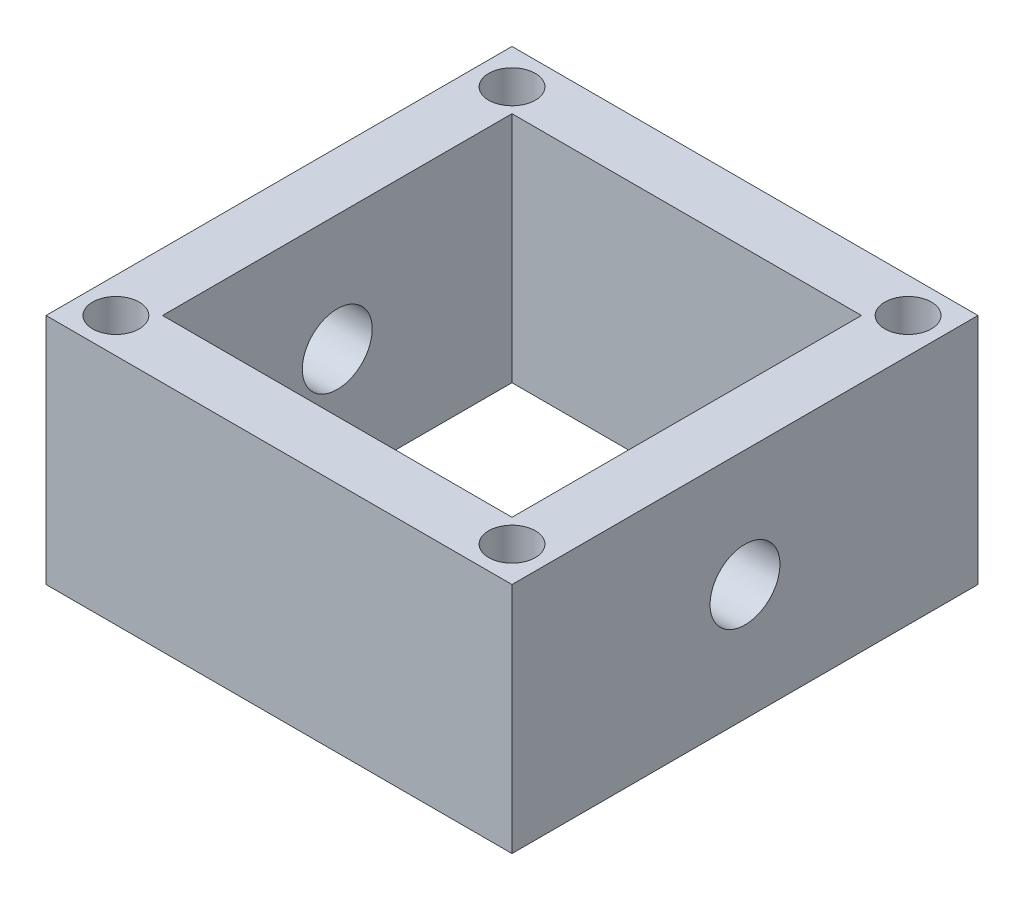
ISO-10303-21;
HEADER;
FILE_DESCRIPTION(('STEP AP214'),'2;1');
FILE_NAME('part.step','',(''),(''),'','','');
FILE_SCHEMA(('AUTOMOTIVE_DESIGN { 1 0 10303 214 1 1 1 1 }'));
ENDSEC;
DATA;
#1=APPLICATION_CONTEXT('core data for automotive mechanical design processes');
#2=APPLICATION_PROTOCOL_DEFINITION('international standard','automotive_design',2000,#1);
#3=PRODUCT_CONTEXT('',#1,'mechanical');
#4=PRODUCT('Part','Part','',(#3));
#5=PRODUCT_RELATED_PRODUCT_CATEGORY('part','',(#4));
#6=PRODUCT_DEFINITION_FORMATION('','',#4);
#7=PRODUCT_DEFINITION_CONTEXT('part definition',#1,'design');
#8=PRODUCT_DEFINITION('design','',#6,#7);
#9=PRODUCT_DEFINITION_SHAPE('','',#8);
#10=(LENGTH_UNIT() NAMED_UNIT(*) SI_UNIT(.MILLI.,.METRE.));
#11=(NAMED_UNIT(*) PLANE_ANGLE_UNIT() SI_UNIT($,.RADIAN.));
#12=(NAMED_UNIT(*) SI_UNIT($,.STERADIAN.) SOLID_ANGLE_UNIT());
#13=UNCERTAINTY_MEASURE_WITH_UNIT(LENGTH_MEASURE(1.E-05),#10,'distance_accuracy_value','');
#14=(GEOMETRIC_REPRESENTATION_CONTEXT(3) GLOBAL_UNCERTAINTY_ASSIGNED_CONTEXT((#13)) GLOBAL_UNIT_ASSIGNED_CONTEXT((#10,
#11,#12)) REPRESENTATION_CONTEXT('',''));
#15=CARTESIAN_POINT('',(0.,0.,0.));
#16=DIRECTION('',(0.,0.,1.));
#17=DIRECTION('',(1.,0.,0.));
#18=AXIS2_PLACEMENT_3D('',#15,#16,#17);
#19=CARTESIAN_POINT('',(0.,10.,0.));
#20=DIRECTION('',(0.,1.,0.));
#21=DIRECTION('',(0.,0.,1.));
#22=AXIS2_PLACEMENT_3D('',#19,#20,#21);
#23=PLANE('',#22);
#24=CARTESIAN_POINT('',(-8.5,10.,8.5));
#25=DIRECTION('',(0.,1.,0.));
#26=DIRECTION('',(0.,0.,1.));
#27=AXIS2_PLACEMENT_3D('',#24,#25,#26);
#28=CIRCLE('',#27,1.);
#29=CARTESIAN_POINT('',(-8.5,10.,9.5));
#30=VERTEX_POINT('',#29);
#31=EDGE_CURVE('E237',#30,#30,#28,.T.);
#32=ORIENTED_EDGE('',*,*,#31,.F.);
#33=EDGE_LOOP('',(#32));
#34=FACE_BOUND('',#33,.T.);
#35=CARTESIAN_POINT('',(8.5,10.,8.5));
#36=DIRECTION('',(0.,1.,0.));
#37=DIRECTION('',(0.,0.,1.));
#38=AXIS2_PLACEMENT_3D('',#35,#36,#37);
#39=CIRCLE('',#38,1.);
#40=CARTESIAN_POINT('',(8.5,10.,9.5));
#41=VERTEX_POINT('',#40);
#42=EDGE_CURVE('E243',#41,#41,#39,.T.);
#43=ORIENTED_EDGE('',*,*,#42,.F.);
#44=EDGE_LOOP('',(#43));
#45=FACE_BOUND('',#44,.T.);
#46=CARTESIAN_POINT('',(8.5,10.,-8.5));
#47=DIRECTION('',(0.,1.,0.));
#48=DIRECTION('',(0.,0.,1.));
#49=AXIS2_PLACEMENT_3D('',#46,#47,#48);
#50=CIRCLE('',#49,1.);
#51=CARTESIAN_POINT('',(8.5,10.,-7.5));
#52=VERTEX_POINT('',#51);
#53=EDGE_CURVE('E231',#52,#52,#50,.T.);
#54=ORIENTED_EDGE('',*,*,#53,.F.);
#55=EDGE_LOOP('',(#54));
#56=FACE_BOUND('',#55,.T.);
#57=CARTESIAN_POINT('',(-8.5,10.,-8.5));
#58=DIRECTION('',(0.,1.,0.));
#59=DIRECTION('',(0.,0.,1.));
#60=AXIS2_PLACEMENT_3D('',#57,#58,#59);
#61=CIRCLE('',#60,1.);
#62=CARTESIAN_POINT('',(-8.5,10.,-7.5));
#63=VERTEX_POINT('',#62);
#64=EDGE_CURVE('E228',#63,#63,#61,.T.);
#65=ORIENTED_EDGE('',*,*,#64,.F.);
#66=EDGE_LOOP('',(#65));
#67=FACE_BOUND('',#66,.T.);
#68=DIRECTION('',(0.,0.,-1.));
#69=VECTOR('',#68,1.);
#70=CARTESIAN_POINT('',(10.,10.,-10.));
#71=LINE('',#70,#69);
#72=CARTESIAN_POINT('',(10.,10.,10.));
#73=VERTEX_POINT('',#72);
#74=CARTESIAN_POINT('',(10.,10.,-10.));
#75=VERTEX_POINT('',#74);
#76=EDGE_CURVE('E142',#73,#75,#71,.T.);
#77=ORIENTED_EDGE('',*,*,#76,.T.);
#78=DIRECTION('',(-1.,0.,0.));
#79=VECTOR('',#78,1.);
#80=CARTESIAN_POINT('',(-10.,10.,-10.));
#81=LINE('',#80,#79);
#82=CARTESIAN_POINT('',(-10.,10.,-10.));
#83=VERTEX_POINT('',#82);
#84=EDGE_CURVE('E145',#75,#83,#81,.T.);
#85=ORIENTED_EDGE('',*,*,#84,.T.);
#86=DIRECTION('',(0.,0.,1.));
#87=VECTOR('',#86,1.);
#88=CARTESIAN_POINT('',(-10.,10.,-10.));
#89=LINE('',#88,#87);
#90=CARTESIAN_POINT('',(-10.,10.,10.));
#91=VERTEX_POINT('',#90);
#92=EDGE_CURVE('E148',#83,#91,#89,.T.);
#93=ORIENTED_EDGE('',*,*,#92,.T.);
#94=DIRECTION('',(1.,0.,0.));
#95=VECTOR('',#94,1.);
#96=CARTESIAN_POINT('',(-10.,10.,10.));
#97=LINE('',#96,#95);
#98=EDGE_CURVE('E150',#91,#73,#97,.T.);
#99=ORIENTED_EDGE('',*,*,#98,.T.);
#100=EDGE_LOOP('',(#77,#85,#93,#99));
#101=FACE_BOUND('',#100,.T.);
#102=DIRECTION('',(-1.,0.,0.));
#103=VECTOR('',#102,1.);
#104=CARTESIAN_POINT('',(-7.5,10.,-7.5));
#105=LINE('',#104,#103);
#106=CARTESIAN_POINT('',(7.5,10.,-7.5));
#107=VERTEX_POINT('',#106);
#108=CARTESIAN_POINT('',(-7.5,10.,-7.5));
#109=VERTEX_POINT('',#108);
#110=EDGE_CURVE('E112',#107,#109,#105,.T.);
#111=ORIENTED_EDGE('',*,*,#110,.F.);
#112=DIRECTION('',(0.,0.,-1.));
#113=VECTOR('',#112,1.);
#114=CARTESIAN_POINT('',(7.5,10.,-7.5));
#115=LINE('',#114,#113);
#116=CARTESIAN_POINT('',(7.5,10.,7.5));
#117=VERTEX_POINT('',#116);
#118=EDGE_CURVE('E104',#117,#107,#115,.T.);
#119=ORIENTED_EDGE('',*,*,#118,.F.);
#120=DIRECTION('',(1.,0.,0.));
#121=VECTOR('',#120,1.);
#122=CARTESIAN_POINT('',(-7.5,10.,7.5));
#123=LINE('',#122,#121);
#124=CARTESIAN_POINT('',(-7.5,10.,7.5));
#125=VERTEX_POINT('',#124);
#126=EDGE_CURVE('E126',#125,#117,#123,.T.);
#127=ORIENTED_EDGE('',*,*,#126,.F.);
#128=DIRECTION('',(0.,0.,1.));
#129=VECTOR('',#128,1.);
#130=CARTESIAN_POINT('',(-7.5,10.,-7.5));
#131=LINE('',#130,#129);
#132=EDGE_CURVE('E124',#109,#125,#131,.T.);
#133=ORIENTED_EDGE('',*,*,#132,.F.);
#134=EDGE_LOOP('',(#111,#119,#127,#133));
#135=FACE_BOUND('',#134,.T.);
#136=ADVANCED_FACE('F38',(#34,#45,#56,#67,#101,#135),#23,.T.);
#137=CARTESIAN_POINT('',(0.,0.,0.));
#138=DIRECTION('',(0.,1.,0.));
#139=DIRECTION('',(0.,0.,1.));
#140=AXIS2_PLACEMENT_3D('',#137,#138,#139);
#141=PLANE('',#140);
#142=DIRECTION('',(0.,0.,-1.));
#143=VECTOR('',#142,1.);
#144=CARTESIAN_POINT('',(10.,0.,-10.));
#145=LINE('',#144,#143);
#146=CARTESIAN_POINT('',(10.,0.,10.));
#147=VERTEX_POINT('',#146);
#148=CARTESIAN_POINT('',(10.,0.,-10.));
#149=VERTEX_POINT('',#148);
#150=EDGE_CURVE('E120',#147,#149,#145,.T.);
#151=ORIENTED_EDGE('',*,*,#150,.F.);
#152=DIRECTION('',(1.,0.,0.));
#153=VECTOR('',#152,1.);
#154=CARTESIAN_POINT('',(-10.,0.,10.));
#155=LINE('',#154,#153);
#156=CARTESIAN_POINT('',(-10.,0.,10.));
#157=VERTEX_POINT('',#156);
#158=EDGE_CURVE('E146',#157,#147,#155,.T.);
#159=ORIENTED_EDGE('',*,*,#158,.F.);
#160=DIRECTION('',(0.,0.,1.));
#161=VECTOR('',#160,1.);
#162=CARTESIAN_POINT('',(-10.,0.,-10.));
#163=LINE('',#162,#161);
#164=CARTESIAN_POINT('',(-10.,0.,-10.));
#165=VERTEX_POINT('',#164);
#166=EDGE_CURVE('E157',#165,#157,#163,.T.);
#167=ORIENTED_EDGE('',*,*,#166,.F.);
#168=DIRECTION('',(-1.,0.,0.));
#169=VECTOR('',#168,1.);
#170=CARTESIAN_POINT('',(-10.,0.,-10.));
#171=LINE('',#170,#169);
#172=EDGE_CURVE('E155',#149,#165,#171,.T.);
#173=ORIENTED_EDGE('',*,*,#172,.F.);
#174=EDGE_LOOP('',(#151,#159,#167,#173));
#175=FACE_BOUND('',#174,.T.);
#176=DIRECTION('',(0.,0.,-1.));
#177=VECTOR('',#176,1.);
#178=CARTESIAN_POINT('',(7.5,0.,-7.5));
#179=LINE('',#178,#177);
#180=CARTESIAN_POINT('',(7.5,0.,7.5));
#181=VERTEX_POINT('',#180);
#182=CARTESIAN_POINT('',(7.5,0.,-7.5));
#183=VERTEX_POINT('',#182);
#184=EDGE_CURVE('E62',#181,#183,#179,.T.);
#185=ORIENTED_EDGE('',*,*,#184,.T.);
#186=DIRECTION('',(-1.,0.,0.));
#187=VECTOR('',#186,1.);
#188=CARTESIAN_POINT('',(-7.5,0.,-7.5));
#189=LINE('',#188,#187);
#190=CARTESIAN_POINT('',(-7.5,0.,-7.5));
#191=VERTEX_POINT('',#190);
#192=EDGE_CURVE('E119',#183,#191,#189,.T.);
#193=ORIENTED_EDGE('',*,*,#192,.T.);
#194=DIRECTION('',(0.,0.,1.));
#195=VECTOR('',#194,1.);
#196=CARTESIAN_POINT('',(-7.5,0.,-7.5));
#197=LINE('',#196,#195);
#198=CARTESIAN_POINT('',(-7.5,0.,7.5));
#199=VERTEX_POINT('',#198);
#200=EDGE_CURVE('E134',#191,#199,#197,.T.);
#201=ORIENTED_EDGE('',*,*,#200,.T.);
#202=DIRECTION('',(1.,0.,0.));
#203=VECTOR('',#202,1.);
#204=CARTESIAN_POINT('',(-7.5,0.,7.5));
#205=LINE('',#204,#203);
#206=EDGE_CURVE('E113',#199,#181,#205,.T.);
#207=ORIENTED_EDGE('',*,*,#206,.T.);
#208=EDGE_LOOP('',(#185,#193,#201,#207));
#209=FACE_BOUND('',#208,.T.);
#210=ADVANCED_FACE('F176',(#175,#209),#141,.F.);
#211=CARTESIAN_POINT('',(10.,10.,-10.));
#212=DIRECTION('',(-1.,0.,0.));
#213=DIRECTION('',(0.,0.,1.));
#214=AXIS2_PLACEMENT_3D('',#211,#212,#213);
#215=PLANE('',#214);
#216=CARTESIAN_POINT('',(10.,5.,0.));
#217=DIRECTION('',(-1.,0.,0.));
#218=DIRECTION('',(0.,0.,1.));
#219=AXIS2_PLACEMENT_3D('',#216,#217,#218);
#220=CIRCLE('',#219,1.5);
#221=CARTESIAN_POINT('',(10.,5.,1.5));
#222=VERTEX_POINT('',#221);
#223=EDGE_CURVE('E220',#222,#222,#220,.T.);
#224=ORIENTED_EDGE('',*,*,#223,.T.);
#225=EDGE_LOOP('',(#224));
#226=FACE_BOUND('',#225,.T.);
#227=ORIENTED_EDGE('',*,*,#150,.T.);
#228=DIRECTION('',(0.,-1.,0.));
#229=VECTOR('',#228,1.);
#230=CARTESIAN_POINT('',(10.,10.,-10.));
#231=LINE('',#230,#229);
#232=EDGE_CURVE('E11',#75,#149,#231,.T.);
#233=ORIENTED_EDGE('',*,*,#232,.F.);
#234=ORIENTED_EDGE('',*,*,#76,.F.);
#235=DIRECTION('',(0.,-1.,0.));
#236=VECTOR('',#235,1.);
#237=CARTESIAN_POINT('',(10.,10.,10.));
#238=LINE('',#237,#236);
#239=EDGE_CURVE('E152',#73,#147,#238,.T.);
#240=ORIENTED_EDGE('',*,*,#239,.T.);
#241=EDGE_LOOP('',(#227,#233,#234,#240));
#242=FACE_BOUND('',#241,.T.);
#243=ADVANCED_FACE('F40',(#226,#242),#215,.F.);
#244=CARTESIAN_POINT('',(-10.,10.,-10.));
#245=DIRECTION('',(0.,0.,1.));
#246=DIRECTION('',(1.,0.,0.));
#247=AXIS2_PLACEMENT_3D('',#244,#245,#246);
#248=PLANE('',#247);
#249=ORIENTED_EDGE('',*,*,#172,.T.);
#250=DIRECTION('',(0.,-1.,0.));
#251=VECTOR('',#250,1.);
#252=CARTESIAN_POINT('',(-10.,10.,-10.));
#253=LINE('',#252,#251);
#254=EDGE_CURVE('E47',#83,#165,#253,.T.);
#255=ORIENTED_EDGE('',*,*,#254,.F.);
#256=ORIENTED_EDGE('',*,*,#84,.F.);
#257=ORIENTED_EDGE('',*,*,#232,.T.);
#258=EDGE_LOOP('',(#249,#255,#256,#257));
#259=FACE_BOUND('',#258,.T.);
#260=ADVANCED_FACE('F186',(#259),#248,.F.);
#261=CARTESIAN_POINT('',(-10.,10.,-10.));
#262=DIRECTION('',(1.,0.,0.));
#263=DIRECTION('',(0.,0.,-1.));
#264=AXIS2_PLACEMENT_3D('',#261,#262,#263);
#265=PLANE('',#264);
#266=CARTESIAN_POINT('',(-10.,5.,0.));
#267=DIRECTION('',(-1.,0.,0.));
#268=DIRECTION('',(0.,0.,1.));
#269=AXIS2_PLACEMENT_3D('',#266,#267,#268);
#270=CIRCLE('',#269,1.5);
#271=CARTESIAN_POINT('',(-10.,5.,1.5));
#272=VERTEX_POINT('',#271);
#273=EDGE_CURVE('E222',#272,#272,#270,.T.);
#274=ORIENTED_EDGE('',*,*,#273,.F.);
#275=EDGE_LOOP('',(#274));
#276=FACE_BOUND('',#275,.T.);
#277=ORIENTED_EDGE('',*,*,#166,.T.);
#278=DIRECTION('',(0.,-1.,0.));
#279=VECTOR('',#278,1.);
#280=CARTESIAN_POINT('',(-10.,10.,10.));
#281=LINE('',#280,#279);
#282=EDGE_CURVE('E162',#91,#157,#281,.T.);
#283=ORIENTED_EDGE('',*,*,#282,.F.);
#284=ORIENTED_EDGE('',*,*,#92,.F.);
#285=ORIENTED_EDGE('',*,*,#254,.T.);
#286=EDGE_LOOP('',(#277,#283,#284,#285));
#287=FACE_BOUND('',#286,.T.);
#288=ADVANCED_FACE('F170',(#276,#287),#265,.F.);
#289=CARTESIAN_POINT('',(-10.,10.,10.));
#290=DIRECTION('',(0.,0.,-1.));
#291=DIRECTION('',(-1.,0.,0.));
#292=AXIS2_PLACEMENT_3D('',#289,#290,#291);
#293=PLANE('',#292);
#294=ORIENTED_EDGE('',*,*,#158,.T.);
#295=ORIENTED_EDGE('',*,*,#239,.F.);
#296=ORIENTED_EDGE('',*,*,#98,.F.);
#297=ORIENTED_EDGE('',*,*,#282,.T.);
#298=EDGE_LOOP('',(#294,#295,#296,#297));
#299=FACE_BOUND('',#298,.T.);
#300=ADVANCED_FACE('F180',(#299),#293,.F.);
#301=CARTESIAN_POINT('',(7.5,10.,-7.5));
#302=DIRECTION('',(-1.,0.,0.));
#303=DIRECTION('',(0.,0.,1.));
#304=AXIS2_PLACEMENT_3D('',#301,#302,#303);
#305=PLANE('',#304);
#306=CARTESIAN_POINT('',(7.5,5.,0.));
#307=DIRECTION('',(-1.,0.,0.));
#308=DIRECTION('',(0.,0.,1.));
#309=AXIS2_PLACEMENT_3D('',#306,#307,#308);
#310=CIRCLE('',#309,1.5);
#311=CARTESIAN_POINT('',(7.5,5.,1.5));
#312=VERTEX_POINT('',#311);
#313=EDGE_CURVE('E132',#312,#312,#310,.T.);
#314=ORIENTED_EDGE('',*,*,#313,.F.);
#315=EDGE_LOOP('',(#314));
#316=FACE_BOUND('',#315,.T.);
#317=ORIENTED_EDGE('',*,*,#184,.F.);
#318=DIRECTION('',(0.,-1.,0.));
#319=VECTOR('',#318,1.);
#320=CARTESIAN_POINT('',(7.5,10.,7.5));
#321=LINE('',#320,#319);
#322=EDGE_CURVE('E108',#117,#181,#321,.T.);
#323=ORIENTED_EDGE('',*,*,#322,.F.);
#324=ORIENTED_EDGE('',*,*,#118,.T.);
#325=DIRECTION('',(0.,-1.,0.));
#326=VECTOR('',#325,1.);
#327=CARTESIAN_POINT('',(7.5,10.,-7.5));
#328=LINE('',#327,#326);
#329=EDGE_CURVE('E107',#107,#183,#328,.T.);
#330=ORIENTED_EDGE('',*,*,#329,.T.);
#331=EDGE_LOOP('',(#317,#323,#324,#330));
#332=FACE_BOUND('',#331,.T.);
#333=ADVANCED_FACE('F106',(#316,#332),#305,.T.);
#334=CARTESIAN_POINT('',(-7.5,10.,-7.5));
#335=DIRECTION('',(0.,0.,1.));
#336=DIRECTION('',(1.,0.,0.));
#337=AXIS2_PLACEMENT_3D('',#334,#335,#336);
#338=PLANE('',#337);
#339=ORIENTED_EDGE('',*,*,#192,.F.);
#340=ORIENTED_EDGE('',*,*,#329,.F.);
#341=ORIENTED_EDGE('',*,*,#110,.T.);
#342=DIRECTION('',(0.,-1.,0.));
#343=VECTOR('',#342,1.);
#344=CARTESIAN_POINT('',(-7.5,10.,-7.5));
#345=LINE('',#344,#343);
#346=EDGE_CURVE('E121',#109,#191,#345,.T.);
#347=ORIENTED_EDGE('',*,*,#346,.T.);
#348=EDGE_LOOP('',(#339,#340,#341,#347));
#349=FACE_BOUND('',#348,.T.);
#350=ADVANCED_FACE('F116',(#349),#338,.T.);
#351=CARTESIAN_POINT('',(-7.5,10.,-7.5));
#352=DIRECTION('',(1.,0.,0.));
#353=DIRECTION('',(0.,0.,-1.));
#354=AXIS2_PLACEMENT_3D('',#351,#352,#353);
#355=PLANE('',#354);
#356=CARTESIAN_POINT('',(-7.5,5.,0.));
#357=DIRECTION('',(1.,0.,0.));
#358=DIRECTION('',(0.,0.,-1.));
#359=AXIS2_PLACEMENT_3D('',#356,#357,#358);
#360=CIRCLE('',#359,1.5);
#361=CARTESIAN_POINT('',(-7.5,5.,-1.5));
#362=VERTEX_POINT('',#361);
#363=EDGE_CURVE('E42',#362,#362,#360,.T.);
#364=ORIENTED_EDGE('',*,*,#363,.F.);
#365=EDGE_LOOP('',(#364));
#366=FACE_BOUND('',#365,.T.);
#367=ORIENTED_EDGE('',*,*,#200,.F.);
#368=ORIENTED_EDGE('',*,*,#346,.F.);
#369=ORIENTED_EDGE('',*,*,#132,.T.);
#370=DIRECTION('',(0.,-1.,0.));
#371=VECTOR('',#370,1.);
#372=CARTESIAN_POINT('',(-7.5,10.,7.5));
#373=LINE('',#372,#371);
#374=EDGE_CURVE('E54',#125,#199,#373,.T.);
#375=ORIENTED_EDGE('',*,*,#374,.T.);
#376=EDGE_LOOP('',(#367,#368,#369,#375));
#377=FACE_BOUND('',#376,.T.);
#378=ADVANCED_FACE('F215',(#366,#377),#355,.T.);
#379=CARTESIAN_POINT('',(-7.5,10.,7.5));
#380=DIRECTION('',(0.,0.,-1.));
#381=DIRECTION('',(-1.,0.,0.));
#382=AXIS2_PLACEMENT_3D('',#379,#380,#381);
#383=PLANE('',#382);
#384=ORIENTED_EDGE('',*,*,#206,.F.);
#385=ORIENTED_EDGE('',*,*,#374,.F.);
#386=ORIENTED_EDGE('',*,*,#126,.T.);
#387=ORIENTED_EDGE('',*,*,#322,.T.);
#388=EDGE_LOOP('',(#384,#385,#386,#387));
#389=FACE_BOUND('',#388,.T.);
#390=ADVANCED_FACE('F275',(#389),#383,.T.);
#391=CARTESIAN_POINT('',(10.,5.,0.));
#392=DIRECTION('',(-1.,0.,0.));
#393=DIRECTION('',(0.,0.,1.));
#394=AXIS2_PLACEMENT_3D('',#391,#392,#393);
#395=CYLINDRICAL_SURFACE('',#394,1.5);
#396=ORIENTED_EDGE('',*,*,#363,.T.);
#397=EDGE_LOOP('',(#396));
#398=FACE_BOUND('',#397,.T.);
#399=ORIENTED_EDGE('',*,*,#273,.T.);
#400=EDGE_LOOP('',(#399));
#401=FACE_BOUND('',#400,.T.);
#402=ADVANCED_FACE('F269',(#398,#401),#395,.F.);
#403=ORIENTED_EDGE('',*,*,#313,.T.);
#404=EDGE_LOOP('',(#403));
#405=FACE_BOUND('',#404,.T.);
#406=ORIENTED_EDGE('',*,*,#223,.F.);
#407=EDGE_LOOP('',(#406));
#408=FACE_BOUND('',#407,.T.);
#409=ADVANCED_FACE('F260',(#405,#408),#395,.F.);
#410=CARTESIAN_POINT('',(-8.5,4.,-8.5));
#411=DIRECTION('',(0.,1.,0.));
#412=DIRECTION('',(0.,0.,1.));
#413=AXIS2_PLACEMENT_3D('',#410,#411,#412);
#414=CYLINDRICAL_SURFACE('',#413,1.);
#415=CARTESIAN_POINT('',(-8.5,4.,-8.5));
#416=DIRECTION('',(0.,1.,0.));
#417=DIRECTION('',(0.,0.,1.));
#418=AXIS2_PLACEMENT_3D('',#415,#416,#417);
#419=CIRCLE('',#418,1.);
#420=CARTESIAN_POINT('',(-8.5,4.,-7.5));
#421=VERTEX_POINT('',#420);
#422=EDGE_CURVE('E225',#421,#421,#419,.T.);
#423=ORIENTED_EDGE('',*,*,#422,.F.);
#424=EDGE_LOOP('',(#423));
#425=FACE_BOUND('',#424,.T.);
#426=ORIENTED_EDGE('',*,*,#64,.T.);
#427=EDGE_LOOP('',(#426));
#428=FACE_BOUND('',#427,.T.);
#429=ADVANCED_FACE('F257',(#425,#428),#414,.F.);
#430=CARTESIAN_POINT('',(-8.5,4.,-8.5));
#431=DIRECTION('',(0.,1.,0.));
#432=DIRECTION('',(0.,0.,1.));
#433=AXIS2_PLACEMENT_3D('',#430,#431,#432);
#434=PLANE('',#433);
#435=ORIENTED_EDGE('',*,*,#422,.T.);
#436=EDGE_LOOP('',(#435));
#437=FACE_BOUND('',#436,.T.);
#438=ADVANCED_FACE('F259',(#437),#434,.T.);
#439=CARTESIAN_POINT('',(8.5,4.,-8.5));
#440=DIRECTION('',(0.,1.,0.));
#441=DIRECTION('',(0.,0.,1.));
#442=AXIS2_PLACEMENT_3D('',#439,#440,#441);
#443=CYLINDRICAL_SURFACE('',#442,1.);
#444=CARTESIAN_POINT('',(8.5,4.,-8.5));
#445=DIRECTION('',(0.,1.,0.));
#446=DIRECTION('',(0.,0.,1.));
#447=AXIS2_PLACEMENT_3D('',#444,#445,#446);
#448=CIRCLE('',#447,1.);
#449=CARTESIAN_POINT('',(8.5,4.,-7.5));
#450=VERTEX_POINT('',#449);
#451=EDGE_CURVE('E246',#450,#450,#448,.T.);
#452=ORIENTED_EDGE('',*,*,#451,.F.);
#453=EDGE_LOOP('',(#452));
#454=FACE_BOUND('',#453,.T.);
#455=ORIENTED_EDGE('',*,*,#53,.T.);
#456=EDGE_LOOP('',(#455));
#457=FACE_BOUND('',#456,.T.);
#458=ADVANCED_FACE('F252',(#454,#457),#443,.F.);
#459=CARTESIAN_POINT('',(8.5,4.,-8.5));
#460=DIRECTION('',(0.,1.,0.));
#461=DIRECTION('',(0.,0.,1.));
#462=AXIS2_PLACEMENT_3D('',#459,#460,#461);
#463=PLANE('',#462);
#464=ORIENTED_EDGE('',*,*,#451,.T.);
#465=EDGE_LOOP('',(#464));
#466=FACE_BOUND('',#465,.T.);
#467=ADVANCED_FACE('F331',(#466),#463,.T.);
#468=CARTESIAN_POINT('',(8.5,4.,8.5));
#469=DIRECTION('',(0.,1.,0.));
#470=DIRECTION('',(0.,0.,1.));
#471=AXIS2_PLACEMENT_3D('',#468,#469,#470);
#472=CYLINDRICAL_SURFACE('',#471,1.);
#473=CARTESIAN_POINT('',(8.5,4.,8.5));
#474=DIRECTION('',(0.,1.,0.));
#475=DIRECTION('',(0.,0.,1.));
#476=AXIS2_PLACEMENT_3D('',#473,#474,#475);
#477=CIRCLE('',#476,1.);
#478=CARTESIAN_POINT('',(8.5,4.,9.5));
#479=VERTEX_POINT('',#478);
#480=EDGE_CURVE('E240',#479,#479,#477,.T.);
#481=ORIENTED_EDGE('',*,*,#480,.F.);
#482=EDGE_LOOP('',(#481));
#483=FACE_BOUND('',#482,.T.);
#484=ORIENTED_EDGE('',*,*,#42,.T.);
#485=EDGE_LOOP('',(#484));
#486=FACE_BOUND('',#485,.T.);
#487=ADVANCED_FACE('F342',(#483,#486),#472,.F.);
#488=CARTESIAN_POINT('',(8.5,4.,8.5));
#489=DIRECTION('',(0.,1.,0.));
#490=DIRECTION('',(0.,0.,1.));
#491=AXIS2_PLACEMENT_3D('',#488,#489,#490);
#492=PLANE('',#491);
#493=ORIENTED_EDGE('',*,*,#480,.T.);
#494=EDGE_LOOP('',(#493));
#495=FACE_BOUND('',#494,.T.);
#496=ADVANCED_FACE('F353',(#495),#492,.T.);
#497=CARTESIAN_POINT('',(-8.5,4.,8.5));
#498=DIRECTION('',(0.,1.,0.));
#499=DIRECTION('',(0.,0.,1.));
#500=AXIS2_PLACEMENT_3D('',#497,#498,#499);
#501=CYLINDRICAL_SURFACE('',#500,1.);
#502=CARTESIAN_POINT('',(-8.5,4.,8.5));
#503=DIRECTION('',(0.,1.,0.));
#504=DIRECTION('',(0.,0.,1.));
#505=AXIS2_PLACEMENT_3D('',#502,#503,#504);
#506=CIRCLE('',#505,1.);
#507=CARTESIAN_POINT('',(-8.5,4.,9.5));
#508=VERTEX_POINT('',#507);
#509=EDGE_CURVE('E234',#508,#508,#506,.T.);
#510=ORIENTED_EDGE('',*,*,#509,.F.);
#511=EDGE_LOOP('',(#510));
#512=FACE_BOUND('',#511,.T.);
#513=ORIENTED_EDGE('',*,*,#31,.T.);
#514=EDGE_LOOP('',(#513));
#515=FACE_BOUND('',#514,.T.);
#516=ADVANCED_FACE('F364',(#512,#515),#501,.F.);
#517=CARTESIAN_POINT('',(-8.5,4.,8.5));
#518=DIRECTION('',(0.,1.,0.));
#519=DIRECTION('',(0.,0.,1.));
#520=AXIS2_PLACEMENT_3D('',#517,#518,#519);
#521=PLANE('',#520);
#522=ORIENTED_EDGE('',*,*,#509,.T.);
#523=EDGE_LOOP('',(#522));
#524=FACE_BOUND('',#523,.T.);
#525=ADVANCED_FACE('F375',(#524),#521,.T.);
#526=CLOSED_SHELL('',(#136,#210,#243,#260,#288,#300,#333,#350,#378,#390,#402,#409,#429,#438,
#458,#467,#487,#496,#516,#525));
#527=MANIFOLD_SOLID_BREP('B2',#526);
#528=ADVANCED_BREP_SHAPE_REPRESENTATION('',(#18,#527),#14);
#529=SHAPE_DEFINITION_REPRESENTATION(#9,#528);
ENDSEC;
END-ISO-10303-21;
